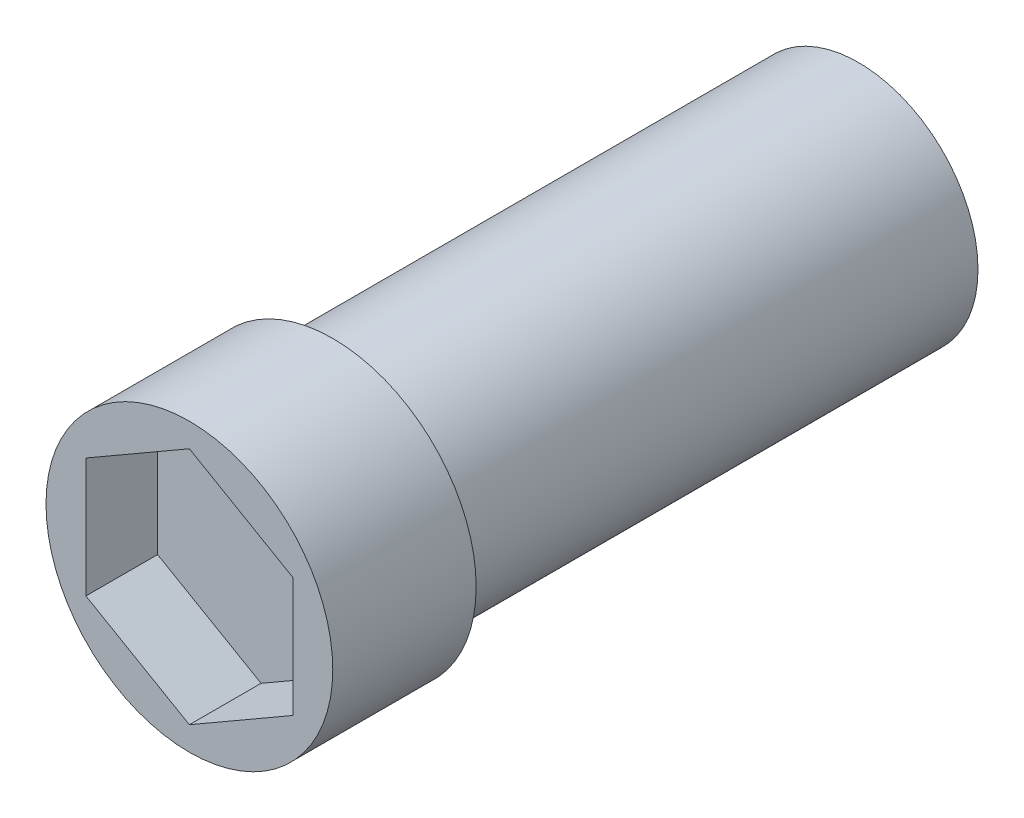
ISO-10303-21;
HEADER;
FILE_DESCRIPTION(('STEP AP214'),'2;1');
FILE_NAME('part.step','',(''),(''),'','','');
FILE_SCHEMA(('AUTOMOTIVE_DESIGN { 1 0 10303 214 1 1 1 1 }'));
ENDSEC;
DATA;
#1=APPLICATION_CONTEXT('core data for automotive mechanical design processes');
#2=APPLICATION_PROTOCOL_DEFINITION('international standard','automotive_design',2000,#1);
#3=PRODUCT_CONTEXT('',#1,'mechanical');
#4=PRODUCT('Part','Part','',(#3));
#5=PRODUCT_RELATED_PRODUCT_CATEGORY('part','',(#4));
#6=PRODUCT_DEFINITION_FORMATION('','',#4);
#7=PRODUCT_DEFINITION_CONTEXT('part definition',#1,'design');
#8=PRODUCT_DEFINITION('design','',#6,#7);
#9=PRODUCT_DEFINITION_SHAPE('','',#8);
#10=(LENGTH_UNIT() NAMED_UNIT(*) SI_UNIT(.MILLI.,.METRE.));
#11=(NAMED_UNIT(*) PLANE_ANGLE_UNIT() SI_UNIT($,.RADIAN.));
#12=(NAMED_UNIT(*) SI_UNIT($,.STERADIAN.) SOLID_ANGLE_UNIT());
#13=UNCERTAINTY_MEASURE_WITH_UNIT(LENGTH_MEASURE(1.E-05),#10,'distance_accuracy_value','');
#14=(GEOMETRIC_REPRESENTATION_CONTEXT(3) GLOBAL_UNCERTAINTY_ASSIGNED_CONTEXT((#13)) GLOBAL_UNIT_ASSIGNED_CONTEXT((#10,
#11,#12)) REPRESENTATION_CONTEXT('',''));
#15=CARTESIAN_POINT('',(0.,0.,0.));
#16=DIRECTION('',(0.,0.,1.));
#17=DIRECTION('',(1.,0.,0.));
#18=AXIS2_PLACEMENT_3D('',#15,#16,#17);
#19=CARTESIAN_POINT('',(0.,0.,11.));
#20=DIRECTION('',(0.,0.,-1.));
#21=DIRECTION('',(-1.,0.,0.));
#22=AXIS2_PLACEMENT_3D('',#19,#20,#21);
#23=CYLINDRICAL_SURFACE('',#22,2.5);
#24=CARTESIAN_POINT('',(0.,0.,11.));
#25=DIRECTION('',(0.,0.,1.));
#26=DIRECTION('',(1.,0.,0.));
#27=AXIS2_PLACEMENT_3D('',#24,#25,#26);
#28=CIRCLE('',#27,2.5);
#29=CARTESIAN_POINT('',(2.5,0.,11.));
#30=VERTEX_POINT('',#29);
#31=EDGE_CURVE('E11',#30,#30,#28,.T.);
#32=ORIENTED_EDGE('',*,*,#31,.F.);
#33=EDGE_LOOP('',(#32));
#34=FACE_BOUND('',#33,.T.);
#35=CARTESIAN_POINT('',(0.,0.,0.));
#36=DIRECTION('',(0.,0.,1.));
#37=DIRECTION('',(1.,0.,0.));
#38=AXIS2_PLACEMENT_3D('',#35,#36,#37);
#39=CIRCLE('',#38,2.5);
#40=CARTESIAN_POINT('',(2.5,0.,0.));
#41=VERTEX_POINT('',#40);
#42=EDGE_CURVE('E38',#41,#41,#39,.T.);
#43=ORIENTED_EDGE('',*,*,#42,.T.);
#44=EDGE_LOOP('',(#43));
#45=FACE_BOUND('',#44,.T.);
#46=ADVANCED_FACE('F35',(#34,#45),#23,.T.);
#47=CARTESIAN_POINT('',(0.,0.,0.));
#48=DIRECTION('',(0.,0.,1.));
#49=DIRECTION('',(1.,0.,0.));
#50=AXIS2_PLACEMENT_3D('',#47,#48,#49);
#51=PLANE('',#50);
#52=ORIENTED_EDGE('',*,*,#42,.F.);
#53=EDGE_LOOP('',(#52));
#54=FACE_BOUND('',#53,.T.);
#55=ADVANCED_FACE('F166',(#54),#51,.F.);
#56=CARTESIAN_POINT('',(0.,0.,14.));
#57=DIRECTION('',(0.,0.,-1.));
#58=DIRECTION('',(-1.,0.,0.));
#59=AXIS2_PLACEMENT_3D('',#56,#57,#58);
#60=CYLINDRICAL_SURFACE('',#59,3.);
#61=CARTESIAN_POINT('',(0.,0.,14.));
#62=DIRECTION('',(0.,0.,1.));
#63=DIRECTION('',(1.,0.,0.));
#64=AXIS2_PLACEMENT_3D('',#61,#62,#63);
#65=CIRCLE('',#64,3.);
#66=CARTESIAN_POINT('',(3.,0.,14.));
#67=VERTEX_POINT('',#66);
#68=EDGE_CURVE('E142',#67,#67,#65,.T.);
#69=ORIENTED_EDGE('',*,*,#68,.F.);
#70=EDGE_LOOP('',(#69));
#71=FACE_BOUND('',#70,.T.);
#72=CARTESIAN_POINT('',(0.,0.,11.));
#73=DIRECTION('',(0.,0.,1.));
#74=DIRECTION('',(1.,0.,0.));
#75=AXIS2_PLACEMENT_3D('',#72,#73,#74);
#76=CIRCLE('',#75,3.);
#77=CARTESIAN_POINT('',(3.,0.,11.));
#78=VERTEX_POINT('',#77);
#79=EDGE_CURVE('E136',#78,#78,#76,.T.);
#80=ORIENTED_EDGE('',*,*,#79,.T.);
#81=EDGE_LOOP('',(#80));
#82=FACE_BOUND('',#81,.T.);
#83=ADVANCED_FACE('F148',(#71,#82),#60,.T.);
#84=CARTESIAN_POINT('',(0.,0.,14.));
#85=DIRECTION('',(0.,0.,1.));
#86=DIRECTION('',(1.,0.,0.));
#87=AXIS2_PLACEMENT_3D('',#84,#85,#86);
#88=PLANE('',#87);
#89=DIRECTION('',(0.,1.,0.));
#90=VECTOR('',#89,1.);
#91=CARTESIAN_POINT('',(2.1650635094611,-1.25,14.));
#92=LINE('',#91,#90);
#93=CARTESIAN_POINT('',(2.1650635094611,-1.25,14.));
#94=VERTEX_POINT('',#93);
#95=CARTESIAN_POINT('',(2.1650635094611,1.25,14.));
#96=VERTEX_POINT('',#95);
#97=EDGE_CURVE('E49',#94,#96,#92,.T.);
#98=ORIENTED_EDGE('',*,*,#97,.F.);
#99=DIRECTION('',(0.866025403784439,0.5,0.));
#100=VECTOR('',#99,1.);
#101=CARTESIAN_POINT('',(0.,-2.5,14.));
#102=LINE('',#101,#100);
#103=CARTESIAN_POINT('',(0.,-2.5,14.));
#104=VERTEX_POINT('',#103);
#105=EDGE_CURVE('E132',#104,#94,#102,.T.);
#106=ORIENTED_EDGE('',*,*,#105,.F.);
#107=DIRECTION('',(0.866025403784439,-0.5,0.));
#108=VECTOR('',#107,1.);
#109=CARTESIAN_POINT('',(-2.1650635094611,-1.25,14.));
#110=LINE('',#109,#108);
#111=CARTESIAN_POINT('',(-2.1650635094611,-1.25,14.));
#112=VERTEX_POINT('',#111);
#113=EDGE_CURVE('E130',#112,#104,#110,.T.);
#114=ORIENTED_EDGE('',*,*,#113,.F.);
#115=DIRECTION('',(0.,-1.,0.));
#116=VECTOR('',#115,1.);
#117=CARTESIAN_POINT('',(-2.1650635094611,1.25,14.));
#118=LINE('',#117,#116);
#119=CARTESIAN_POINT('',(-2.1650635094611,1.25,14.));
#120=VERTEX_POINT('',#119);
#121=EDGE_CURVE('E97',#120,#112,#118,.T.);
#122=ORIENTED_EDGE('',*,*,#121,.F.);
#123=DIRECTION('',(-0.866025403784438,-0.5,0.));
#124=VECTOR('',#123,1.);
#125=CARTESIAN_POINT('',(0.,2.5,14.));
#126=LINE('',#125,#124);
#127=CARTESIAN_POINT('',(0.,2.5,14.));
#128=VERTEX_POINT('',#127);
#129=EDGE_CURVE('E126',#128,#120,#126,.T.);
#130=ORIENTED_EDGE('',*,*,#129,.F.);
#131=DIRECTION('',(-0.866025403784439,0.5,0.));
#132=VECTOR('',#131,1.);
#133=CARTESIAN_POINT('',(2.1650635094611,1.25,14.));
#134=LINE('',#133,#132);
#135=EDGE_CURVE('E123',#96,#128,#134,.T.);
#136=ORIENTED_EDGE('',*,*,#135,.F.);
#137=EDGE_LOOP('',(#98,#106,#114,#122,#130,#136));
#138=FACE_BOUND('',#137,.T.);
#139=ORIENTED_EDGE('',*,*,#68,.T.);
#140=EDGE_LOOP('',(#139));
#141=FACE_BOUND('',#140,.T.);
#142=ADVANCED_FACE('F153',(#138,#141),#88,.T.);
#143=CARTESIAN_POINT('',(0.,0.,11.));
#144=DIRECTION('',(0.,0.,1.));
#145=DIRECTION('',(1.,0.,0.));
#146=AXIS2_PLACEMENT_3D('',#143,#144,#145);
#147=PLANE('',#146);
#148=ORIENTED_EDGE('',*,*,#31,.T.);
#149=EDGE_LOOP('',(#148));
#150=FACE_BOUND('',#149,.T.);
#151=ORIENTED_EDGE('',*,*,#79,.F.);
#152=EDGE_LOOP('',(#151));
#153=FACE_BOUND('',#152,.T.);
#154=ADVANCED_FACE('F150',(#150,#153),#147,.F.);
#155=CARTESIAN_POINT('',(2.1650635094611,-1.25,12.5));
#156=DIRECTION('',(1.,0.,0.));
#157=DIRECTION('',(0.,1.,0.));
#158=AXIS2_PLACEMENT_3D('',#155,#156,#157);
#159=PLANE('',#158);
#160=ORIENTED_EDGE('',*,*,#97,.T.);
#161=DIRECTION('',(0.,0.,1.));
#162=VECTOR('',#161,1.);
#163=CARTESIAN_POINT('',(2.1650635094611,1.25,12.5));
#164=LINE('',#163,#162);
#165=CARTESIAN_POINT('',(2.1650635094611,1.25,12.5));
#166=VERTEX_POINT('',#165);
#167=EDGE_CURVE('E79',#166,#96,#164,.T.);
#168=ORIENTED_EDGE('',*,*,#167,.F.);
#169=DIRECTION('',(0.,1.,0.));
#170=VECTOR('',#169,1.);
#171=CARTESIAN_POINT('',(2.1650635094611,-1.25,12.5));
#172=LINE('',#171,#170);
#173=CARTESIAN_POINT('',(2.1650635094611,-1.25,12.5));
#174=VERTEX_POINT('',#173);
#175=EDGE_CURVE('E134',#174,#166,#172,.T.);
#176=ORIENTED_EDGE('',*,*,#175,.F.);
#177=DIRECTION('',(0.,0.,1.));
#178=VECTOR('',#177,1.);
#179=CARTESIAN_POINT('',(2.1650635094611,-1.25,12.5));
#180=LINE('',#179,#178);
#181=EDGE_CURVE('E57',#174,#94,#180,.T.);
#182=ORIENTED_EDGE('',*,*,#181,.T.);
#183=EDGE_LOOP('',(#160,#168,#176,#182));
#184=FACE_BOUND('',#183,.T.);
#185=ADVANCED_FACE('F152',(#184),#159,.F.);
#186=CARTESIAN_POINT('',(0.,-2.5,12.5));
#187=DIRECTION('',(0.5,-0.866025403784439,0.));
#188=DIRECTION('',(0.866025403784439,0.5,0.));
#189=AXIS2_PLACEMENT_3D('',#186,#187,#188);
#190=PLANE('',#189);
#191=ORIENTED_EDGE('',*,*,#105,.T.);
#192=ORIENTED_EDGE('',*,*,#181,.F.);
#193=DIRECTION('',(0.866025403784439,0.5,0.));
#194=VECTOR('',#193,1.);
#195=CARTESIAN_POINT('',(0.,-2.5,12.5));
#196=LINE('',#195,#194);
#197=CARTESIAN_POINT('',(0.,-2.5,12.5));
#198=VERTEX_POINT('',#197);
#199=EDGE_CURVE('E109',#198,#174,#196,.T.);
#200=ORIENTED_EDGE('',*,*,#199,.F.);
#201=DIRECTION('',(0.,0.,1.));
#202=VECTOR('',#201,1.);
#203=CARTESIAN_POINT('',(0.,-2.5,12.5));
#204=LINE('',#203,#202);
#205=EDGE_CURVE('E101',#198,#104,#204,.T.);
#206=ORIENTED_EDGE('',*,*,#205,.T.);
#207=EDGE_LOOP('',(#191,#192,#200,#206));
#208=FACE_BOUND('',#207,.T.);
#209=ADVANCED_FACE('F160',(#208),#190,.F.);
#210=CARTESIAN_POINT('',(-2.1650635094611,-1.25,12.5));
#211=DIRECTION('',(-0.5,-0.866025403784439,0.));
#212=DIRECTION('',(0.866025403784439,-0.5,0.));
#213=AXIS2_PLACEMENT_3D('',#210,#211,#212);
#214=PLANE('',#213);
#215=ORIENTED_EDGE('',*,*,#113,.T.);
#216=ORIENTED_EDGE('',*,*,#205,.F.);
#217=DIRECTION('',(0.866025403784439,-0.5,0.));
#218=VECTOR('',#217,1.);
#219=CARTESIAN_POINT('',(-2.1650635094611,-1.25,12.5));
#220=LINE('',#219,#218);
#221=CARTESIAN_POINT('',(-2.1650635094611,-1.25,12.5));
#222=VERTEX_POINT('',#221);
#223=EDGE_CURVE('E105',#222,#198,#220,.T.);
#224=ORIENTED_EDGE('',*,*,#223,.F.);
#225=DIRECTION('',(0.,0.,1.));
#226=VECTOR('',#225,1.);
#227=CARTESIAN_POINT('',(-2.1650635094611,-1.25,12.5));
#228=LINE('',#227,#226);
#229=EDGE_CURVE('E90',#222,#112,#228,.T.);
#230=ORIENTED_EDGE('',*,*,#229,.T.);
#231=EDGE_LOOP('',(#215,#216,#224,#230));
#232=FACE_BOUND('',#231,.T.);
#233=ADVANCED_FACE('F106',(#232),#214,.F.);
#234=CARTESIAN_POINT('',(-2.1650635094611,1.25,12.5));
#235=DIRECTION('',(-1.,0.,0.));
#236=DIRECTION('',(0.,-1.,0.));
#237=AXIS2_PLACEMENT_3D('',#234,#235,#236);
#238=PLANE('',#237);
#239=ORIENTED_EDGE('',*,*,#121,.T.);
#240=ORIENTED_EDGE('',*,*,#229,.F.);
#241=DIRECTION('',(0.,-1.,0.));
#242=VECTOR('',#241,1.);
#243=CARTESIAN_POINT('',(-2.1650635094611,1.25,12.5));
#244=LINE('',#243,#242);
#245=CARTESIAN_POINT('',(-2.1650635094611,1.25,12.5));
#246=VERTEX_POINT('',#245);
#247=EDGE_CURVE('E94',#246,#222,#244,.T.);
#248=ORIENTED_EDGE('',*,*,#247,.F.);
#249=DIRECTION('',(0.,0.,1.));
#250=VECTOR('',#249,1.);
#251=CARTESIAN_POINT('',(-2.1650635094611,1.25,12.5));
#252=LINE('',#251,#250);
#253=EDGE_CURVE('E102',#246,#120,#252,.T.);
#254=ORIENTED_EDGE('',*,*,#253,.T.);
#255=EDGE_LOOP('',(#239,#240,#248,#254));
#256=FACE_BOUND('',#255,.T.);
#257=ADVANCED_FACE('F92',(#256),#238,.F.);
#258=CARTESIAN_POINT('',(0.,2.5,12.5));
#259=DIRECTION('',(-0.5,0.866025403784439,0.));
#260=DIRECTION('',(-0.866025403784439,-0.5,0.));
#261=AXIS2_PLACEMENT_3D('',#258,#259,#260);
#262=PLANE('',#261);
#263=ORIENTED_EDGE('',*,*,#129,.T.);
#264=ORIENTED_EDGE('',*,*,#253,.F.);
#265=DIRECTION('',(-0.866025403784438,-0.5,0.));
#266=VECTOR('',#265,1.);
#267=CARTESIAN_POINT('',(0.,2.5,12.5));
#268=LINE('',#267,#266);
#269=CARTESIAN_POINT('',(0.,2.5,12.5));
#270=VERTEX_POINT('',#269);
#271=EDGE_CURVE('E115',#270,#246,#268,.T.);
#272=ORIENTED_EDGE('',*,*,#271,.F.);
#273=DIRECTION('',(0.,0.,1.));
#274=VECTOR('',#273,1.);
#275=CARTESIAN_POINT('',(0.,2.5,12.5));
#276=LINE('',#275,#274);
#277=EDGE_CURVE('E139',#270,#128,#276,.T.);
#278=ORIENTED_EDGE('',*,*,#277,.T.);
#279=EDGE_LOOP('',(#263,#264,#272,#278));
#280=FACE_BOUND('',#279,.T.);
#281=ADVANCED_FACE('F221',(#280),#262,.F.);
#282=CARTESIAN_POINT('',(2.1650635094611,1.25,12.5));
#283=DIRECTION('',(0.5,0.866025403784439,0.));
#284=DIRECTION('',(-0.866025403784439,0.5,0.));
#285=AXIS2_PLACEMENT_3D('',#282,#283,#284);
#286=PLANE('',#285);
#287=ORIENTED_EDGE('',*,*,#135,.T.);
#288=ORIENTED_EDGE('',*,*,#277,.F.);
#289=DIRECTION('',(-0.866025403784439,0.5,0.));
#290=VECTOR('',#289,1.);
#291=CARTESIAN_POINT('',(2.1650635094611,1.25,12.5));
#292=LINE('',#291,#290);
#293=EDGE_CURVE('E117',#166,#270,#292,.T.);
#294=ORIENTED_EDGE('',*,*,#293,.F.);
#295=ORIENTED_EDGE('',*,*,#167,.T.);
#296=EDGE_LOOP('',(#287,#288,#294,#295));
#297=FACE_BOUND('',#296,.T.);
#298=ADVANCED_FACE('F230',(#297),#286,.F.);
#299=CARTESIAN_POINT('',(0.,0.,12.5));
#300=DIRECTION('',(0.,0.,1.));
#301=DIRECTION('',(1.,0.,0.));
#302=AXIS2_PLACEMENT_3D('',#299,#300,#301);
#303=PLANE('',#302);
#304=ORIENTED_EDGE('',*,*,#175,.T.);
#305=ORIENTED_EDGE('',*,*,#293,.T.);
#306=ORIENTED_EDGE('',*,*,#271,.T.);
#307=ORIENTED_EDGE('',*,*,#247,.T.);
#308=ORIENTED_EDGE('',*,*,#223,.T.);
#309=ORIENTED_EDGE('',*,*,#199,.T.);
#310=EDGE_LOOP('',(#304,#305,#306,#307,#308,#309));
#311=FACE_BOUND('',#310,.T.);
#312=ADVANCED_FACE('F112',(#311),#303,.T.);
#313=CLOSED_SHELL('',(#46,#55,#83,#142,#154,#185,#209,#233,#257,#281,#298,#312));
#314=MANIFOLD_SOLID_BREP('B2',#313);
#315=ADVANCED_BREP_SHAPE_REPRESENTATION('',(#18,#314),#14);
#316=SHAPE_DEFINITION_REPRESENTATION(#9,#315);
ENDSEC;
END-ISO-10303-21;
